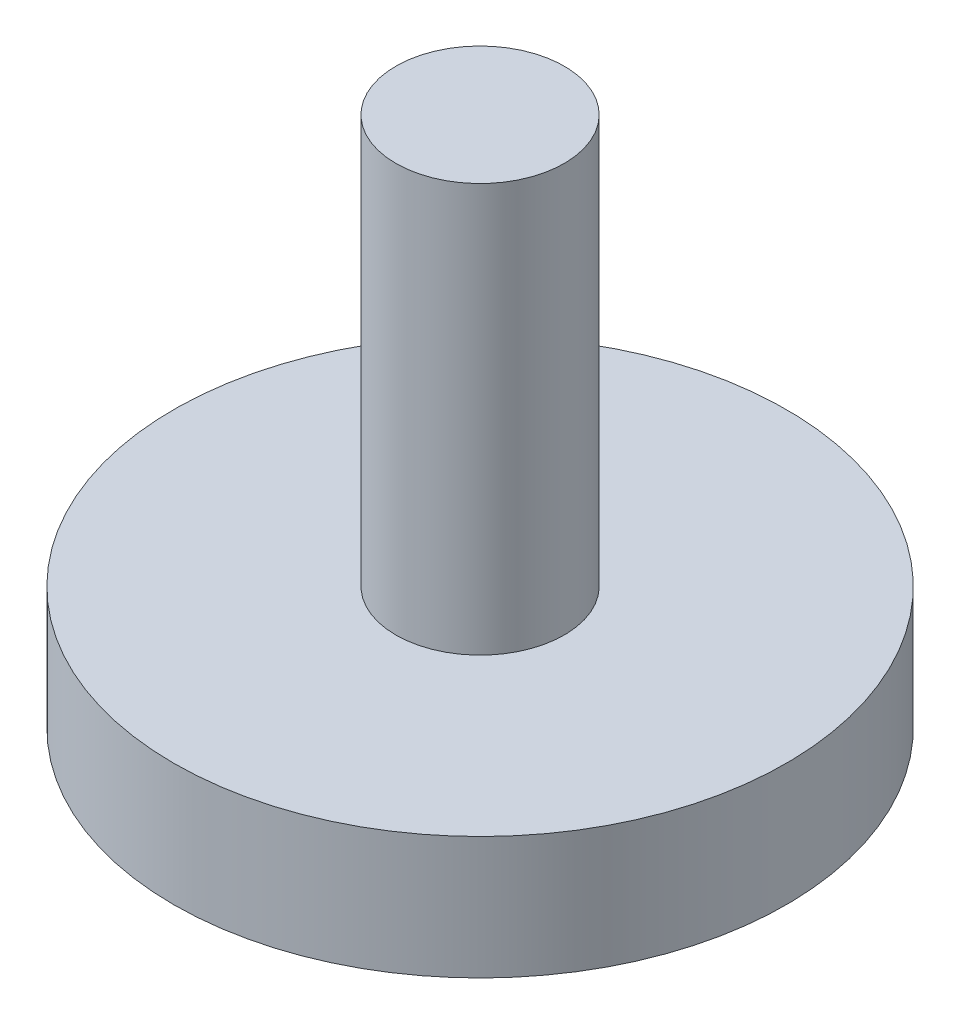
ISO-10303-21;
HEADER;
FILE_DESCRIPTION(('STEP AP214'),'2;1');
FILE_NAME('part.step','',(''),(''),'','','');
FILE_SCHEMA(('AUTOMOTIVE_DESIGN { 1 0 10303 214 1 1 1 1 }'));
ENDSEC;
DATA;
#1=APPLICATION_CONTEXT('core data for automotive mechanical design processes');
#2=APPLICATION_PROTOCOL_DEFINITION('international standard','automotive_design',2000,#1);
#3=PRODUCT_CONTEXT('',#1,'mechanical');
#4=PRODUCT('Part','Part','',(#3));
#5=PRODUCT_RELATED_PRODUCT_CATEGORY('part','',(#4));
#6=PRODUCT_DEFINITION_FORMATION('','',#4);
#7=PRODUCT_DEFINITION_CONTEXT('part definition',#1,'design');
#8=PRODUCT_DEFINITION('design','',#6,#7);
#9=PRODUCT_DEFINITION_SHAPE('','',#8);
#10=(LENGTH_UNIT() NAMED_UNIT(*) SI_UNIT(.MILLI.,.METRE.));
#11=(NAMED_UNIT(*) PLANE_ANGLE_UNIT() SI_UNIT($,.RADIAN.));
#12=(NAMED_UNIT(*) SI_UNIT($,.STERADIAN.) SOLID_ANGLE_UNIT());
#13=UNCERTAINTY_MEASURE_WITH_UNIT(LENGTH_MEASURE(1.E-05),#10,'distance_accuracy_value','');
#14=(GEOMETRIC_REPRESENTATION_CONTEXT(3) GLOBAL_UNCERTAINTY_ASSIGNED_CONTEXT((#13)) GLOBAL_UNIT_ASSIGNED_CONTEXT((#10,
#11,#12)) REPRESENTATION_CONTEXT('',''));
#15=CARTESIAN_POINT('',(0.,0.,0.));
#16=DIRECTION('',(0.,0.,1.));
#17=DIRECTION('',(1.,0.,0.));
#18=AXIS2_PLACEMENT_3D('',#15,#16,#17);
#19=CARTESIAN_POINT('',(0.,3.,0.));
#20=DIRECTION('',(0.,-1.,0.));
#21=DIRECTION('',(0.,0.,-1.));
#22=AXIS2_PLACEMENT_3D('',#19,#20,#21);
#23=CYLINDRICAL_SURFACE('',#22,7.5);
#24=CARTESIAN_POINT('',(0.,3.,0.));
#25=DIRECTION('',(0.,1.,0.));
#26=DIRECTION('',(0.,0.,1.));
#27=AXIS2_PLACEMENT_3D('',#24,#25,#26);
#28=CIRCLE('',#27,7.5);
#29=CARTESIAN_POINT('',(0.,3.,7.5));
#30=VERTEX_POINT('',#29);
#31=EDGE_CURVE('E45',#30,#30,#28,.T.);
#32=ORIENTED_EDGE('',*,*,#31,.F.);
#33=EDGE_LOOP('',(#32));
#34=FACE_BOUND('',#33,.T.);
#35=CARTESIAN_POINT('',(0.,0.,0.));
#36=DIRECTION('',(0.,1.,0.));
#37=DIRECTION('',(0.,0.,1.));
#38=AXIS2_PLACEMENT_3D('',#35,#36,#37);
#39=CIRCLE('',#38,7.5);
#40=CARTESIAN_POINT('',(0.,0.,7.5));
#41=VERTEX_POINT('',#40);
#42=EDGE_CURVE('E40',#41,#41,#39,.T.);
#43=ORIENTED_EDGE('',*,*,#42,.T.);
#44=EDGE_LOOP('',(#43));
#45=FACE_BOUND('',#44,.T.);
#46=ADVANCED_FACE('F37',(#34,#45),#23,.T.);
#47=CARTESIAN_POINT('',(0.,3.,0.));
#48=DIRECTION('',(0.,1.,0.));
#49=DIRECTION('',(0.,0.,1.));
#50=AXIS2_PLACEMENT_3D('',#47,#48,#49);
#51=PLANE('',#50);
#52=CARTESIAN_POINT('',(0.,3.,0.));
#53=DIRECTION('',(0.,1.,0.));
#54=DIRECTION('',(0.,0.,1.));
#55=AXIS2_PLACEMENT_3D('',#52,#53,#54);
#56=CIRCLE('',#55,2.0625);
#57=CARTESIAN_POINT('',(0.,3.,2.0625));
#58=VERTEX_POINT('',#57);
#59=EDGE_CURVE('E10',#58,#58,#56,.T.);
#60=ORIENTED_EDGE('',*,*,#59,.F.);
#61=EDGE_LOOP('',(#60));
#62=FACE_BOUND('',#61,.T.);
#63=ORIENTED_EDGE('',*,*,#31,.T.);
#64=EDGE_LOOP('',(#63));
#65=FACE_BOUND('',#64,.T.);
#66=ADVANCED_FACE('F65',(#62,#65),#51,.T.);
#67=CARTESIAN_POINT('',(0.,0.,0.));
#68=DIRECTION('',(0.,1.,0.));
#69=DIRECTION('',(0.,0.,1.));
#70=AXIS2_PLACEMENT_3D('',#67,#68,#69);
#71=PLANE('',#70);
#72=ORIENTED_EDGE('',*,*,#42,.F.);
#73=EDGE_LOOP('',(#72));
#74=FACE_BOUND('',#73,.T.);
#75=ADVANCED_FACE('F62',(#74),#71,.F.);
#76=CARTESIAN_POINT('',(0.,13.,0.));
#77=DIRECTION('',(0.,-1.,0.));
#78=DIRECTION('',(0.,0.,-1.));
#79=AXIS2_PLACEMENT_3D('',#76,#77,#78);
#80=CYLINDRICAL_SURFACE('',#79,2.0625);
#81=CARTESIAN_POINT('',(0.,13.,0.));
#82=DIRECTION('',(0.,1.,0.));
#83=DIRECTION('',(0.,0.,1.));
#84=AXIS2_PLACEMENT_3D('',#81,#82,#83);
#85=CIRCLE('',#84,2.0625);
#86=CARTESIAN_POINT('',(0.,13.,2.0625));
#87=VERTEX_POINT('',#86);
#88=EDGE_CURVE('E52',#87,#87,#85,.T.);
#89=ORIENTED_EDGE('',*,*,#88,.F.);
#90=EDGE_LOOP('',(#89));
#91=FACE_BOUND('',#90,.T.);
#92=ORIENTED_EDGE('',*,*,#59,.T.);
#93=EDGE_LOOP('',(#92));
#94=FACE_BOUND('',#93,.T.);
#95=ADVANCED_FACE('F64',(#91,#94),#80,.T.);
#96=CARTESIAN_POINT('',(0.,13.,0.));
#97=DIRECTION('',(0.,1.,0.));
#98=DIRECTION('',(0.,0.,1.));
#99=AXIS2_PLACEMENT_3D('',#96,#97,#98);
#100=PLANE('',#99);
#101=ORIENTED_EDGE('',*,*,#88,.T.);
#102=EDGE_LOOP('',(#101));
#103=FACE_BOUND('',#102,.T.);
#104=ADVANCED_FACE('F70',(#103),#100,.T.);
#105=CLOSED_SHELL('',(#46,#66,#75,#95,#104));
#106=MANIFOLD_SOLID_BREP('B2',#105);
#107=ADVANCED_BREP_SHAPE_REPRESENTATION('',(#18,#106),#14);
#108=SHAPE_DEFINITION_REPRESENTATION(#9,#107);
ENDSEC;
END-ISO-10303-21;
